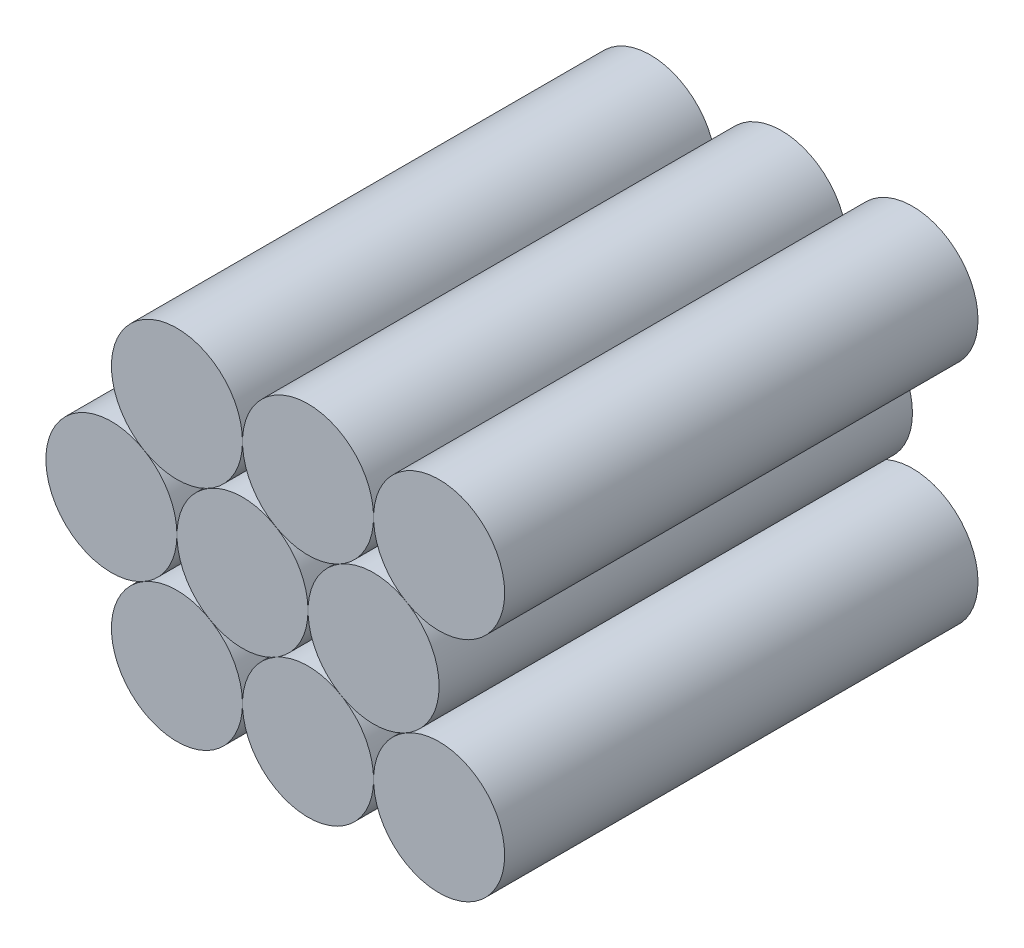
ISO-10303-21;
HEADER;
FILE_DESCRIPTION(('STEP AP214'),'2;1');
FILE_NAME('part.step','',(''),(''),'','','');
FILE_SCHEMA(('AUTOMOTIVE_DESIGN { 1 0 10303 214 1 1 1 1 }'));
ENDSEC;
DATA;
#1=APPLICATION_CONTEXT('core data for automotive mechanical design processes');
#2=APPLICATION_PROTOCOL_DEFINITION('international standard','automotive_design',2000,#1);
#3=PRODUCT_CONTEXT('',#1,'mechanical');
#4=PRODUCT('Part','Part','',(#3));
#5=PRODUCT_RELATED_PRODUCT_CATEGORY('part','',(#4));
#6=PRODUCT_DEFINITION_FORMATION('','',#4);
#7=PRODUCT_DEFINITION_CONTEXT('part definition',#1,'design');
#8=PRODUCT_DEFINITION('design','',#6,#7);
#9=PRODUCT_DEFINITION_SHAPE('','',#8);
#10=(LENGTH_UNIT() NAMED_UNIT(*) SI_UNIT(.MILLI.,.METRE.));
#11=(NAMED_UNIT(*) PLANE_ANGLE_UNIT() SI_UNIT($,.RADIAN.));
#12=(NAMED_UNIT(*) SI_UNIT($,.STERADIAN.) SOLID_ANGLE_UNIT());
#13=UNCERTAINTY_MEASURE_WITH_UNIT(LENGTH_MEASURE(1.E-05),#10,'distance_accuracy_value','');
#14=(GEOMETRIC_REPRESENTATION_CONTEXT(3) GLOBAL_UNCERTAINTY_ASSIGNED_CONTEXT((#13)) GLOBAL_UNIT_ASSIGNED_CONTEXT((#10,
#11,#12)) REPRESENTATION_CONTEXT('',''));
#15=CARTESIAN_POINT('',(0.,0.,0.));
#16=DIRECTION('',(0.,0.,1.));
#17=DIRECTION('',(1.,0.,0.));
#18=AXIS2_PLACEMENT_3D('',#15,#16,#17);
#19=CARTESIAN_POINT('',(27.,-15.5884572681199,65.));
#20=DIRECTION('',(0.,0.,-1.));
#21=DIRECTION('',(-1.,0.,0.));
#22=AXIS2_PLACEMENT_3D('',#19,#20,#21);
#23=CYLINDRICAL_SURFACE('',#22,9.);
#24=CARTESIAN_POINT('',(27.,-15.5884572681199,65.));
#25=DIRECTION('',(0.,0.,1.));
#26=DIRECTION('',(1.,0.,0.));
#27=AXIS2_PLACEMENT_3D('',#24,#25,#26);
#28=CIRCLE('',#27,9.);
#29=CARTESIAN_POINT('',(36.,-15.5884572681199,65.));
#30=VERTEX_POINT('',#29);
#31=EDGE_CURVE('E12',#30,#30,#28,.T.);
#32=ORIENTED_EDGE('',*,*,#31,.F.);
#33=EDGE_LOOP('',(#32));
#34=FACE_BOUND('',#33,.T.);
#35=CARTESIAN_POINT('',(27.,-15.5884572681199,0.));
#36=DIRECTION('',(0.,0.,1.));
#37=DIRECTION('',(1.,0.,0.));
#38=AXIS2_PLACEMENT_3D('',#35,#36,#37);
#39=CIRCLE('',#38,9.);
#40=CARTESIAN_POINT('',(36.,-15.5884572681199,0.));
#41=VERTEX_POINT('',#40);
#42=EDGE_CURVE('E135',#41,#41,#39,.T.);
#43=ORIENTED_EDGE('',*,*,#42,.T.);
#44=EDGE_LOOP('',(#43));
#45=FACE_BOUND('',#44,.T.);
#46=ADVANCED_FACE('F132',(#34,#45),#23,.T.);
#47=CARTESIAN_POINT('',(0.,0.,65.));
#48=DIRECTION('',(0.,0.,1.));
#49=DIRECTION('',(1.,0.,0.));
#50=AXIS2_PLACEMENT_3D('',#47,#48,#49);
#51=PLANE('',#50);
#52=ORIENTED_EDGE('',*,*,#31,.T.);
#53=EDGE_LOOP('',(#52));
#54=FACE_BOUND('',#53,.T.);
#55=ADVANCED_FACE('F147',(#54),#51,.T.);
#56=CARTESIAN_POINT('',(0.,0.,0.));
#57=DIRECTION('',(0.,0.,1.));
#58=DIRECTION('',(1.,0.,0.));
#59=AXIS2_PLACEMENT_3D('',#56,#57,#58);
#60=PLANE('',#59);
#61=ORIENTED_EDGE('',*,*,#42,.F.);
#62=EDGE_LOOP('',(#61));
#63=FACE_BOUND('',#62,.T.);
#64=ADVANCED_FACE('F145',(#63),#60,.F.);
#65=CLOSED_SHELL('',(#46,#55,#64));
#66=MANIFOLD_SOLID_BREP('B2',#65);
#67=CARTESIAN_POINT('',(-9.,-15.5884572681199,65.));
#68=DIRECTION('',(0.,0.,-1.));
#69=DIRECTION('',(-1.,0.,0.));
#70=AXIS2_PLACEMENT_3D('',#67,#68,#69);
#71=CYLINDRICAL_SURFACE('',#70,9.);
#72=CARTESIAN_POINT('',(-9.,-15.5884572681199,65.));
#73=DIRECTION('',(0.,0.,1.));
#74=DIRECTION('',(1.,0.,0.));
#75=AXIS2_PLACEMENT_3D('',#72,#73,#74);
#76=CIRCLE('',#75,9.);
#77=CARTESIAN_POINT('',(0.,-15.5884572681199,65.));
#78=VERTEX_POINT('',#77);
#79=EDGE_CURVE('E131',#78,#78,#76,.T.);
#80=ORIENTED_EDGE('',*,*,#79,.F.);
#81=EDGE_LOOP('',(#80));
#82=FACE_BOUND('',#81,.T.);
#83=CARTESIAN_POINT('',(-9.,-15.5884572681199,0.));
#84=DIRECTION('',(0.,0.,1.));
#85=DIRECTION('',(1.,0.,0.));
#86=AXIS2_PLACEMENT_3D('',#83,#84,#85);
#87=CIRCLE('',#86,9.);
#88=CARTESIAN_POINT('',(0.,-15.5884572681199,0.));
#89=VERTEX_POINT('',#88);
#90=EDGE_CURVE('E184',#89,#89,#87,.T.);
#91=ORIENTED_EDGE('',*,*,#90,.T.);
#92=EDGE_LOOP('',(#91));
#93=FACE_BOUND('',#92,.T.);
#94=ADVANCED_FACE('F181',(#82,#93),#71,.T.);
#95=CARTESIAN_POINT('',(0.,0.,65.));
#96=DIRECTION('',(0.,0.,1.));
#97=DIRECTION('',(1.,0.,0.));
#98=AXIS2_PLACEMENT_3D('',#95,#96,#97);
#99=PLANE('',#98);
#100=ORIENTED_EDGE('',*,*,#79,.T.);
#101=EDGE_LOOP('',(#100));
#102=FACE_BOUND('',#101,.T.);
#103=ADVANCED_FACE('F196',(#102),#99,.T.);
#104=CARTESIAN_POINT('',(0.,0.,0.));
#105=DIRECTION('',(0.,0.,1.));
#106=DIRECTION('',(1.,0.,0.));
#107=AXIS2_PLACEMENT_3D('',#104,#105,#106);
#108=PLANE('',#107);
#109=ORIENTED_EDGE('',*,*,#90,.F.);
#110=EDGE_LOOP('',(#109));
#111=FACE_BOUND('',#110,.T.);
#112=ADVANCED_FACE('F194',(#111),#108,.F.);
#113=CLOSED_SHELL('',(#94,#103,#112));
#114=MANIFOLD_SOLID_BREP('B7',#113);
#115=CARTESIAN_POINT('',(9.,-15.5884572681199,65.));
#116=DIRECTION('',(0.,0.,-1.));
#117=DIRECTION('',(-1.,0.,0.));
#118=AXIS2_PLACEMENT_3D('',#115,#116,#117);
#119=CYLINDRICAL_SURFACE('',#118,9.);
#120=CARTESIAN_POINT('',(9.,-15.5884572681199,65.));
#121=DIRECTION('',(0.,0.,1.));
#122=DIRECTION('',(1.,0.,0.));
#123=AXIS2_PLACEMENT_3D('',#120,#121,#122);
#124=CIRCLE('',#123,9.);
#125=CARTESIAN_POINT('',(18.,-15.5884572681199,65.));
#126=VERTEX_POINT('',#125);
#127=EDGE_CURVE('E180',#126,#126,#124,.T.);
#128=ORIENTED_EDGE('',*,*,#127,.F.);
#129=EDGE_LOOP('',(#128));
#130=FACE_BOUND('',#129,.T.);
#131=CARTESIAN_POINT('',(9.,-15.5884572681199,0.));
#132=DIRECTION('',(0.,0.,1.));
#133=DIRECTION('',(1.,0.,0.));
#134=AXIS2_PLACEMENT_3D('',#131,#132,#133);
#135=CIRCLE('',#134,9.);
#136=CARTESIAN_POINT('',(18.,-15.5884572681199,0.));
#137=VERTEX_POINT('',#136);
#138=EDGE_CURVE('E233',#137,#137,#135,.T.);
#139=ORIENTED_EDGE('',*,*,#138,.T.);
#140=EDGE_LOOP('',(#139));
#141=FACE_BOUND('',#140,.T.);
#142=ADVANCED_FACE('F230',(#130,#141),#119,.T.);
#143=CARTESIAN_POINT('',(0.,0.,65.));
#144=DIRECTION('',(0.,0.,1.));
#145=DIRECTION('',(1.,0.,0.));
#146=AXIS2_PLACEMENT_3D('',#143,#144,#145);
#147=PLANE('',#146);
#148=ORIENTED_EDGE('',*,*,#127,.T.);
#149=EDGE_LOOP('',(#148));
#150=FACE_BOUND('',#149,.T.);
#151=ADVANCED_FACE('F245',(#150),#147,.T.);
#152=CARTESIAN_POINT('',(0.,0.,0.));
#153=DIRECTION('',(0.,0.,1.));
#154=DIRECTION('',(1.,0.,0.));
#155=AXIS2_PLACEMENT_3D('',#152,#153,#154);
#156=PLANE('',#155);
#157=ORIENTED_EDGE('',*,*,#138,.F.);
#158=EDGE_LOOP('',(#157));
#159=FACE_BOUND('',#158,.T.);
#160=ADVANCED_FACE('F243',(#159),#156,.F.);
#161=CLOSED_SHELL('',(#142,#151,#160));
#162=MANIFOLD_SOLID_BREP('B126',#161);
#163=CARTESIAN_POINT('',(18.,0.,65.));
#164=DIRECTION('',(0.,0.,-1.));
#165=DIRECTION('',(-1.,0.,0.));
#166=AXIS2_PLACEMENT_3D('',#163,#164,#165);
#167=CYLINDRICAL_SURFACE('',#166,9.);
#168=CARTESIAN_POINT('',(18.,0.,65.));
#169=DIRECTION('',(0.,0.,1.));
#170=DIRECTION('',(1.,0.,0.));
#171=AXIS2_PLACEMENT_3D('',#168,#169,#170);
#172=CIRCLE('',#171,9.);
#173=CARTESIAN_POINT('',(27.,0.,65.));
#174=VERTEX_POINT('',#173);
#175=EDGE_CURVE('E229',#174,#174,#172,.T.);
#176=ORIENTED_EDGE('',*,*,#175,.F.);
#177=EDGE_LOOP('',(#176));
#178=FACE_BOUND('',#177,.T.);
#179=CARTESIAN_POINT('',(18.,0.,0.));
#180=DIRECTION('',(0.,0.,1.));
#181=DIRECTION('',(1.,0.,0.));
#182=AXIS2_PLACEMENT_3D('',#179,#180,#181);
#183=CIRCLE('',#182,9.);
#184=CARTESIAN_POINT('',(27.,0.,0.));
#185=VERTEX_POINT('',#184);
#186=EDGE_CURVE('E282',#185,#185,#183,.T.);
#187=ORIENTED_EDGE('',*,*,#186,.T.);
#188=EDGE_LOOP('',(#187));
#189=FACE_BOUND('',#188,.T.);
#190=ADVANCED_FACE('F279',(#178,#189),#167,.T.);
#191=CARTESIAN_POINT('',(0.,0.,65.));
#192=DIRECTION('',(0.,0.,1.));
#193=DIRECTION('',(1.,0.,0.));
#194=AXIS2_PLACEMENT_3D('',#191,#192,#193);
#195=PLANE('',#194);
#196=ORIENTED_EDGE('',*,*,#175,.T.);
#197=EDGE_LOOP('',(#196));
#198=FACE_BOUND('',#197,.T.);
#199=ADVANCED_FACE('F294',(#198),#195,.T.);
#200=CARTESIAN_POINT('',(0.,0.,0.));
#201=DIRECTION('',(0.,0.,1.));
#202=DIRECTION('',(1.,0.,0.));
#203=AXIS2_PLACEMENT_3D('',#200,#201,#202);
#204=PLANE('',#203);
#205=ORIENTED_EDGE('',*,*,#186,.F.);
#206=EDGE_LOOP('',(#205));
#207=FACE_BOUND('',#206,.T.);
#208=ADVANCED_FACE('F292',(#207),#204,.F.);
#209=CLOSED_SHELL('',(#190,#199,#208));
#210=MANIFOLD_SOLID_BREP('B175',#209);
#211=CARTESIAN_POINT('',(27.,15.5884572681199,65.));
#212=DIRECTION('',(0.,0.,-1.));
#213=DIRECTION('',(-1.,0.,0.));
#214=AXIS2_PLACEMENT_3D('',#211,#212,#213);
#215=CYLINDRICAL_SURFACE('',#214,9.);
#216=CARTESIAN_POINT('',(27.,15.5884572681199,65.));
#217=DIRECTION('',(0.,0.,1.));
#218=DIRECTION('',(1.,0.,0.));
#219=AXIS2_PLACEMENT_3D('',#216,#217,#218);
#220=CIRCLE('',#219,9.);
#221=CARTESIAN_POINT('',(36.,15.5884572681199,65.));
#222=VERTEX_POINT('',#221);
#223=EDGE_CURVE('E278',#222,#222,#220,.T.);
#224=ORIENTED_EDGE('',*,*,#223,.F.);
#225=EDGE_LOOP('',(#224));
#226=FACE_BOUND('',#225,.T.);
#227=CARTESIAN_POINT('',(27.,15.5884572681199,0.));
#228=DIRECTION('',(0.,0.,1.));
#229=DIRECTION('',(1.,0.,0.));
#230=AXIS2_PLACEMENT_3D('',#227,#228,#229);
#231=CIRCLE('',#230,9.);
#232=CARTESIAN_POINT('',(36.,15.5884572681199,0.));
#233=VERTEX_POINT('',#232);
#234=EDGE_CURVE('E331',#233,#233,#231,.T.);
#235=ORIENTED_EDGE('',*,*,#234,.T.);
#236=EDGE_LOOP('',(#235));
#237=FACE_BOUND('',#236,.T.);
#238=ADVANCED_FACE('F328',(#226,#237),#215,.T.);
#239=CARTESIAN_POINT('',(0.,0.,65.));
#240=DIRECTION('',(0.,0.,1.));
#241=DIRECTION('',(1.,0.,0.));
#242=AXIS2_PLACEMENT_3D('',#239,#240,#241);
#243=PLANE('',#242);
#244=ORIENTED_EDGE('',*,*,#223,.T.);
#245=EDGE_LOOP('',(#244));
#246=FACE_BOUND('',#245,.T.);
#247=ADVANCED_FACE('F343',(#246),#243,.T.);
#248=CARTESIAN_POINT('',(0.,0.,0.));
#249=DIRECTION('',(0.,0.,1.));
#250=DIRECTION('',(1.,0.,0.));
#251=AXIS2_PLACEMENT_3D('',#248,#249,#250);
#252=PLANE('',#251);
#253=ORIENTED_EDGE('',*,*,#234,.F.);
#254=EDGE_LOOP('',(#253));
#255=FACE_BOUND('',#254,.T.);
#256=ADVANCED_FACE('F341',(#255),#252,.F.);
#257=CLOSED_SHELL('',(#238,#247,#256));
#258=MANIFOLD_SOLID_BREP('B224',#257);
#259=CARTESIAN_POINT('',(9.,15.5884572681199,65.));
#260=DIRECTION('',(0.,0.,-1.));
#261=DIRECTION('',(-1.,0.,0.));
#262=AXIS2_PLACEMENT_3D('',#259,#260,#261);
#263=CYLINDRICAL_SURFACE('',#262,9.);
#264=CARTESIAN_POINT('',(9.,15.5884572681199,65.));
#265=DIRECTION('',(0.,0.,1.));
#266=DIRECTION('',(1.,0.,0.));
#267=AXIS2_PLACEMENT_3D('',#264,#265,#266);
#268=CIRCLE('',#267,9.);
#269=CARTESIAN_POINT('',(18.,15.5884572681199,65.));
#270=VERTEX_POINT('',#269);
#271=EDGE_CURVE('E327',#270,#270,#268,.T.);
#272=ORIENTED_EDGE('',*,*,#271,.F.);
#273=EDGE_LOOP('',(#272));
#274=FACE_BOUND('',#273,.T.);
#275=CARTESIAN_POINT('',(9.,15.5884572681199,0.));
#276=DIRECTION('',(0.,0.,1.));
#277=DIRECTION('',(1.,0.,0.));
#278=AXIS2_PLACEMENT_3D('',#275,#276,#277);
#279=CIRCLE('',#278,9.);
#280=CARTESIAN_POINT('',(18.,15.5884572681199,0.));
#281=VERTEX_POINT('',#280);
#282=EDGE_CURVE('E380',#281,#281,#279,.T.);
#283=ORIENTED_EDGE('',*,*,#282,.T.);
#284=EDGE_LOOP('',(#283));
#285=FACE_BOUND('',#284,.T.);
#286=ADVANCED_FACE('F377',(#274,#285),#263,.T.);
#287=CARTESIAN_POINT('',(0.,0.,65.));
#288=DIRECTION('',(0.,0.,1.));
#289=DIRECTION('',(1.,0.,0.));
#290=AXIS2_PLACEMENT_3D('',#287,#288,#289);
#291=PLANE('',#290);
#292=ORIENTED_EDGE('',*,*,#271,.T.);
#293=EDGE_LOOP('',(#292));
#294=FACE_BOUND('',#293,.T.);
#295=ADVANCED_FACE('F392',(#294),#291,.T.);
#296=CARTESIAN_POINT('',(0.,0.,0.));
#297=DIRECTION('',(0.,0.,1.));
#298=DIRECTION('',(1.,0.,0.));
#299=AXIS2_PLACEMENT_3D('',#296,#297,#298);
#300=PLANE('',#299);
#301=ORIENTED_EDGE('',*,*,#282,.F.);
#302=EDGE_LOOP('',(#301));
#303=FACE_BOUND('',#302,.T.);
#304=ADVANCED_FACE('F390',(#303),#300,.F.);
#305=CLOSED_SHELL('',(#286,#295,#304));
#306=MANIFOLD_SOLID_BREP('B273',#305);
#307=CARTESIAN_POINT('',(0.,0.,65.));
#308=DIRECTION('',(0.,0.,-1.));
#309=DIRECTION('',(-1.,0.,0.));
#310=AXIS2_PLACEMENT_3D('',#307,#308,#309);
#311=CYLINDRICAL_SURFACE('',#310,9.);
#312=CARTESIAN_POINT('',(0.,0.,65.));
#313=DIRECTION('',(0.,0.,1.));
#314=DIRECTION('',(1.,0.,0.));
#315=AXIS2_PLACEMENT_3D('',#312,#313,#314);
#316=CIRCLE('',#315,9.);
#317=CARTESIAN_POINT('',(9.,0.,65.));
#318=VERTEX_POINT('',#317);
#319=EDGE_CURVE('E376',#318,#318,#316,.T.);
#320=ORIENTED_EDGE('',*,*,#319,.F.);
#321=EDGE_LOOP('',(#320));
#322=FACE_BOUND('',#321,.T.);
#323=CARTESIAN_POINT('',(0.,0.,0.));
#324=DIRECTION('',(0.,0.,1.));
#325=DIRECTION('',(1.,0.,0.));
#326=AXIS2_PLACEMENT_3D('',#323,#324,#325);
#327=CIRCLE('',#326,9.);
#328=CARTESIAN_POINT('',(9.,0.,0.));
#329=VERTEX_POINT('',#328);
#330=EDGE_CURVE('E429',#329,#329,#327,.T.);
#331=ORIENTED_EDGE('',*,*,#330,.T.);
#332=EDGE_LOOP('',(#331));
#333=FACE_BOUND('',#332,.T.);
#334=ADVANCED_FACE('F426',(#322,#333),#311,.T.);
#335=CARTESIAN_POINT('',(0.,0.,65.));
#336=DIRECTION('',(0.,0.,1.));
#337=DIRECTION('',(1.,0.,0.));
#338=AXIS2_PLACEMENT_3D('',#335,#336,#337);
#339=PLANE('',#338);
#340=ORIENTED_EDGE('',*,*,#319,.T.);
#341=EDGE_LOOP('',(#340));
#342=FACE_BOUND('',#341,.T.);
#343=ADVANCED_FACE('F441',(#342),#339,.T.);
#344=CARTESIAN_POINT('',(0.,0.,0.));
#345=DIRECTION('',(0.,0.,1.));
#346=DIRECTION('',(1.,0.,0.));
#347=AXIS2_PLACEMENT_3D('',#344,#345,#346);
#348=PLANE('',#347);
#349=ORIENTED_EDGE('',*,*,#330,.F.);
#350=EDGE_LOOP('',(#349));
#351=FACE_BOUND('',#350,.T.);
#352=ADVANCED_FACE('F439',(#351),#348,.F.);
#353=CLOSED_SHELL('',(#334,#343,#352));
#354=MANIFOLD_SOLID_BREP('B322',#353);
#355=CARTESIAN_POINT('',(-9.,15.5884572681199,65.));
#356=DIRECTION('',(0.,0.,-1.));
#357=DIRECTION('',(-1.,0.,0.));
#358=AXIS2_PLACEMENT_3D('',#355,#356,#357);
#359=CYLINDRICAL_SURFACE('',#358,9.);
#360=CARTESIAN_POINT('',(-9.,15.5884572681199,65.));
#361=DIRECTION('',(0.,0.,1.));
#362=DIRECTION('',(1.,0.,0.));
#363=AXIS2_PLACEMENT_3D('',#360,#361,#362);
#364=CIRCLE('',#363,9.);
#365=CARTESIAN_POINT('',(0.,15.5884572681199,65.));
#366=VERTEX_POINT('',#365);
#367=EDGE_CURVE('E425',#366,#366,#364,.T.);
#368=ORIENTED_EDGE('',*,*,#367,.F.);
#369=EDGE_LOOP('',(#368));
#370=FACE_BOUND('',#369,.T.);
#371=CARTESIAN_POINT('',(-9.,15.5884572681199,0.));
#372=DIRECTION('',(0.,0.,1.));
#373=DIRECTION('',(1.,0.,0.));
#374=AXIS2_PLACEMENT_3D('',#371,#372,#373);
#375=CIRCLE('',#374,9.);
#376=CARTESIAN_POINT('',(0.,15.5884572681199,0.));
#377=VERTEX_POINT('',#376);
#378=EDGE_CURVE('E477',#377,#377,#375,.T.);
#379=ORIENTED_EDGE('',*,*,#378,.T.);
#380=EDGE_LOOP('',(#379));
#381=FACE_BOUND('',#380,.T.);
#382=ADVANCED_FACE('F474',(#370,#381),#359,.T.);
#383=CARTESIAN_POINT('',(0.,0.,65.));
#384=DIRECTION('',(0.,0.,1.));
#385=DIRECTION('',(1.,0.,0.));
#386=AXIS2_PLACEMENT_3D('',#383,#384,#385);
#387=PLANE('',#386);
#388=ORIENTED_EDGE('',*,*,#367,.T.);
#389=EDGE_LOOP('',(#388));
#390=FACE_BOUND('',#389,.T.);
#391=ADVANCED_FACE('F489',(#390),#387,.T.);
#392=CARTESIAN_POINT('',(0.,0.,0.));
#393=DIRECTION('',(0.,0.,1.));
#394=DIRECTION('',(1.,0.,0.));
#395=AXIS2_PLACEMENT_3D('',#392,#393,#394);
#396=PLANE('',#395);
#397=ORIENTED_EDGE('',*,*,#378,.F.);
#398=EDGE_LOOP('',(#397));
#399=FACE_BOUND('',#398,.T.);
#400=ADVANCED_FACE('F487',(#399),#396,.F.);
#401=CLOSED_SHELL('',(#382,#391,#400));
#402=MANIFOLD_SOLID_BREP('B371',#401);
#403=CARTESIAN_POINT('',(-18.,0.,65.));
#404=DIRECTION('',(0.,0.,-1.));
#405=DIRECTION('',(-1.,0.,0.));
#406=AXIS2_PLACEMENT_3D('',#403,#404,#405);
#407=CYLINDRICAL_SURFACE('',#406,9.);
#408=CARTESIAN_POINT('',(-18.,0.,65.));
#409=DIRECTION('',(0.,0.,1.));
#410=DIRECTION('',(1.,0.,0.));
#411=AXIS2_PLACEMENT_3D('',#408,#409,#410);
#412=CIRCLE('',#411,9.);
#413=CARTESIAN_POINT('',(-9.,0.,65.));
#414=VERTEX_POINT('',#413);
#415=EDGE_CURVE('E473',#414,#414,#412,.T.);
#416=ORIENTED_EDGE('',*,*,#415,.F.);
#417=EDGE_LOOP('',(#416));
#418=FACE_BOUND('',#417,.T.);
#419=CARTESIAN_POINT('',(-18.,0.,0.));
#420=DIRECTION('',(0.,0.,1.));
#421=DIRECTION('',(1.,0.,0.));
#422=AXIS2_PLACEMENT_3D('',#419,#420,#421);
#423=CIRCLE('',#422,9.);
#424=CARTESIAN_POINT('',(-9.,0.,0.));
#425=VERTEX_POINT('',#424);
#426=EDGE_CURVE('E518',#425,#425,#423,.T.);
#427=ORIENTED_EDGE('',*,*,#426,.T.);
#428=EDGE_LOOP('',(#427));
#429=FACE_BOUND('',#428,.T.);
#430=ADVANCED_FACE('F515',(#418,#429),#407,.T.);
#431=CARTESIAN_POINT('',(0.,0.,65.));
#432=DIRECTION('',(0.,0.,1.));
#433=DIRECTION('',(1.,0.,0.));
#434=AXIS2_PLACEMENT_3D('',#431,#432,#433);
#435=PLANE('',#434);
#436=ORIENTED_EDGE('',*,*,#415,.T.);
#437=EDGE_LOOP('',(#436));
#438=FACE_BOUND('',#437,.T.);
#439=ADVANCED_FACE('F530',(#438),#435,.T.);
#440=CARTESIAN_POINT('',(0.,0.,0.));
#441=DIRECTION('',(0.,0.,1.));
#442=DIRECTION('',(1.,0.,0.));
#443=AXIS2_PLACEMENT_3D('',#440,#441,#442);
#444=PLANE('',#443);
#445=ORIENTED_EDGE('',*,*,#426,.F.);
#446=EDGE_LOOP('',(#445));
#447=FACE_BOUND('',#446,.T.);
#448=ADVANCED_FACE('F528',(#447),#444,.F.);
#449=CLOSED_SHELL('',(#430,#439,#448));
#450=MANIFOLD_SOLID_BREP('B420',#449);
#451=ADVANCED_BREP_SHAPE_REPRESENTATION('',(#18,#66,#114,#162,#210,#258,#306,#354,#402,#450),#14);
#452=SHAPE_DEFINITION_REPRESENTATION(#9,#451);
ENDSEC;
END-ISO-10303-21;
